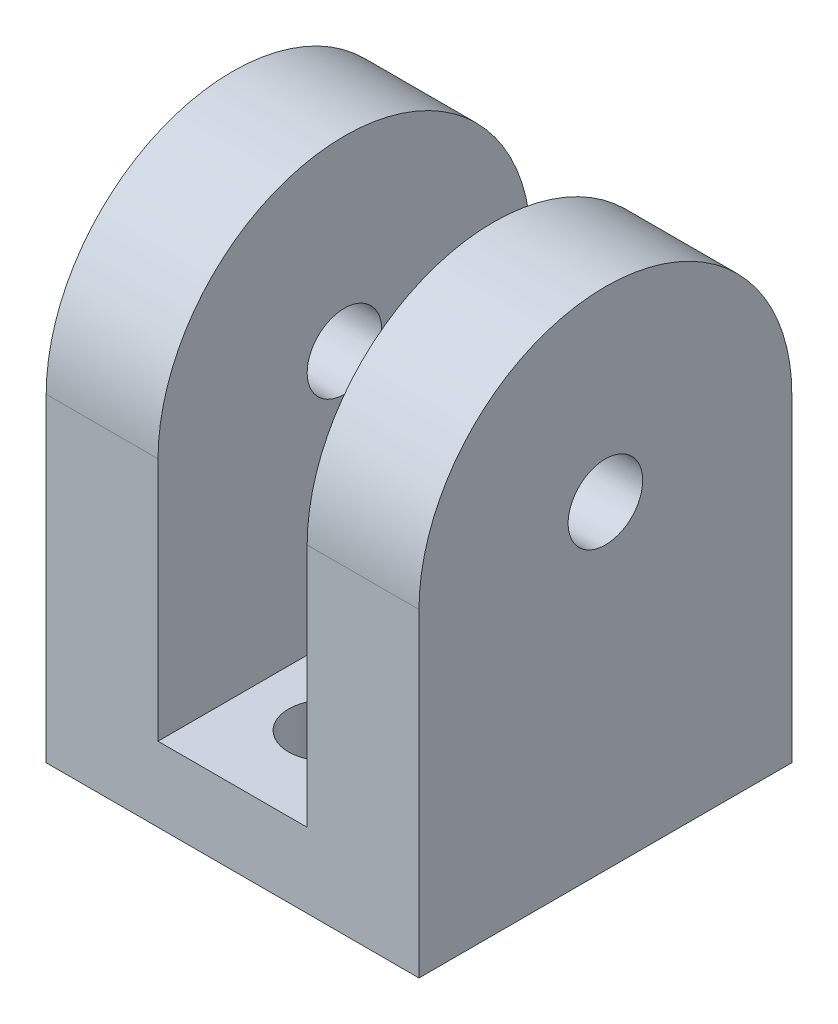
ISO-10303-21;
HEADER;
FILE_DESCRIPTION(('STEP AP214'),'2;1');
FILE_NAME('part.step','',(''),(''),'','','');
FILE_SCHEMA(('AUTOMOTIVE_DESIGN { 1 0 10303 214 1 1 1 1 }'));
ENDSEC;
DATA;
#1=APPLICATION_CONTEXT('core data for automotive mechanical design processes');
#2=APPLICATION_PROTOCOL_DEFINITION('international standard','automotive_design',2000,#1);
#3=PRODUCT_CONTEXT('',#1,'mechanical');
#4=PRODUCT('Part','Part','',(#3));
#5=PRODUCT_RELATED_PRODUCT_CATEGORY('part','',(#4));
#6=PRODUCT_DEFINITION_FORMATION('','',#4);
#7=PRODUCT_DEFINITION_CONTEXT('part definition',#1,'design');
#8=PRODUCT_DEFINITION('design','',#6,#7);
#9=PRODUCT_DEFINITION_SHAPE('','',#8);
#10=(LENGTH_UNIT() NAMED_UNIT(*) SI_UNIT(.MILLI.,.METRE.));
#11=(NAMED_UNIT(*) PLANE_ANGLE_UNIT() SI_UNIT($,.RADIAN.));
#12=(NAMED_UNIT(*) SI_UNIT($,.STERADIAN.) SOLID_ANGLE_UNIT());
#13=UNCERTAINTY_MEASURE_WITH_UNIT(LENGTH_MEASURE(1.E-05),#10,'distance_accuracy_value','');
#14=(GEOMETRIC_REPRESENTATION_CONTEXT(3) GLOBAL_UNCERTAINTY_ASSIGNED_CONTEXT((#13)) GLOBAL_UNIT_ASSIGNED_CONTEXT((#10,
#11,#12)) REPRESENTATION_CONTEXT('',''));
#15=CARTESIAN_POINT('',(0.,0.,0.));
#16=DIRECTION('',(0.,0.,1.));
#17=DIRECTION('',(1.,0.,0.));
#18=AXIS2_PLACEMENT_3D('',#15,#16,#17);
#19=CARTESIAN_POINT('',(0.,27.178,-15.875));
#20=DIRECTION('',(1.,0.,0.));
#21=DIRECTION('',(0.,0.,-1.));
#22=AXIS2_PLACEMENT_3D('',#19,#20,#21);
#23=CYLINDRICAL_SURFACE('',#22,15.875);
#24=DIRECTION('',(1.,0.,0.));
#25=VECTOR('',#24,1.);
#26=CARTESIAN_POINT('',(0.,27.178,0.));
#27=LINE('',#26,#25);
#28=CARTESIAN_POINT('',(0.,27.178,0.));
#29=VERTEX_POINT('',#28);
#30=CARTESIAN_POINT('',(9.525,27.178,0.));
#31=VERTEX_POINT('',#30);
#32=EDGE_CURVE('E141',#29,#31,#27,.T.);
#33=ORIENTED_EDGE('',*,*,#32,.T.);
#34=CARTESIAN_POINT('',(9.525,27.178,-15.875));
#35=DIRECTION('',(-1.,0.,0.));
#36=DIRECTION('',(0.,0.,1.));
#37=AXIS2_PLACEMENT_3D('',#34,#35,#36);
#38=CIRCLE('',#37,15.875);
#39=CARTESIAN_POINT('',(9.525,27.178,-31.75));
#40=VERTEX_POINT('',#39);
#41=EDGE_CURVE('E11',#31,#40,#38,.T.);
#42=ORIENTED_EDGE('',*,*,#41,.T.);
#43=DIRECTION('',(1.,0.,0.));
#44=VECTOR('',#43,1.);
#45=CARTESIAN_POINT('',(0.,27.178,-31.75));
#46=LINE('',#45,#44);
#47=CARTESIAN_POINT('',(0.,27.178,-31.75));
#48=VERTEX_POINT('',#47);
#49=EDGE_CURVE('E121',#48,#40,#46,.T.);
#50=ORIENTED_EDGE('',*,*,#49,.F.);
#51=CARTESIAN_POINT('',(0.,27.178,-15.875));
#52=DIRECTION('',(-1.,0.,0.));
#53=DIRECTION('',(0.,0.,1.));
#54=AXIS2_PLACEMENT_3D('',#51,#52,#53);
#55=CIRCLE('',#54,15.875);
#56=EDGE_CURVE('E134',#29,#48,#55,.T.);
#57=ORIENTED_EDGE('',*,*,#56,.F.);
#58=EDGE_LOOP('',(#33,#42,#50,#57));
#59=FACE_BOUND('',#58,.T.);
#60=ADVANCED_FACE('F34',(#59),#23,.T.);
#61=CARTESIAN_POINT('',(0.,50.8,-31.75));
#62=DIRECTION('',(0.,0.,1.));
#63=DIRECTION('',(1.,0.,0.));
#64=AXIS2_PLACEMENT_3D('',#61,#62,#63);
#65=PLANE('',#64);
#66=ORIENTED_EDGE('',*,*,#49,.T.);
#67=DIRECTION('',(0.,-1.,0.));
#68=VECTOR('',#67,1.);
#69=CARTESIAN_POINT('',(9.525,6.35,-31.75));
#70=LINE('',#69,#68);
#71=CARTESIAN_POINT('',(9.525,6.35,-31.75));
#72=VERTEX_POINT('',#71);
#73=EDGE_CURVE('E104',#40,#72,#70,.T.);
#74=ORIENTED_EDGE('',*,*,#73,.T.);
#75=DIRECTION('',(1.,0.,0.));
#76=VECTOR('',#75,1.);
#77=CARTESIAN_POINT('',(9.525,6.35,-31.75));
#78=LINE('',#77,#76);
#79=CARTESIAN_POINT('',(22.225,6.35,-31.75));
#80=VERTEX_POINT('',#79);
#81=EDGE_CURVE('E114',#72,#80,#78,.T.);
#82=ORIENTED_EDGE('',*,*,#81,.T.);
#83=DIRECTION('',(0.,1.,0.));
#84=VECTOR('',#83,1.);
#85=CARTESIAN_POINT('',(22.225,6.35,-31.75));
#86=LINE('',#85,#84);
#87=CARTESIAN_POINT('',(22.225,27.178,-31.75));
#88=VERTEX_POINT('',#87);
#89=EDGE_CURVE('E111',#80,#88,#86,.T.);
#90=ORIENTED_EDGE('',*,*,#89,.T.);
#91=CARTESIAN_POINT('',(31.75,27.178,-31.75));
#92=VERTEX_POINT('',#91);
#93=EDGE_CURVE('E58',#88,#92,#46,.T.);
#94=ORIENTED_EDGE('',*,*,#93,.T.);
#95=DIRECTION('',(0.,-1.,0.));
#96=VECTOR('',#95,1.);
#97=CARTESIAN_POINT('',(31.75,50.8,-31.75));
#98=LINE('',#97,#96);
#99=CARTESIAN_POINT('',(31.75,0.,-31.75));
#100=VERTEX_POINT('',#99);
#101=EDGE_CURVE('E157',#92,#100,#98,.T.);
#102=ORIENTED_EDGE('',*,*,#101,.T.);
#103=DIRECTION('',(-1.,0.,0.));
#104=VECTOR('',#103,1.);
#105=CARTESIAN_POINT('',(0.,0.,-31.75));
#106=LINE('',#105,#104);
#107=CARTESIAN_POINT('',(0.,0.,-31.75));
#108=VERTEX_POINT('',#107);
#109=EDGE_CURVE('E152',#100,#108,#106,.T.);
#110=ORIENTED_EDGE('',*,*,#109,.T.);
#111=DIRECTION('',(0.,-1.,0.));
#112=VECTOR('',#111,1.);
#113=CARTESIAN_POINT('',(0.,50.8,-31.75));
#114=LINE('',#113,#112);
#115=EDGE_CURVE('E155',#48,#108,#114,.T.);
#116=ORIENTED_EDGE('',*,*,#115,.F.);
#117=EDGE_LOOP('',(#66,#74,#82,#90,#94,#102,#110,#116));
#118=FACE_BOUND('',#117,.T.);
#119=ADVANCED_FACE('F119',(#118),#65,.F.);
#120=CARTESIAN_POINT('',(0.,50.8,0.));
#121=DIRECTION('',(1.,0.,0.));
#122=DIRECTION('',(0.,0.,-1.));
#123=AXIS2_PLACEMENT_3D('',#120,#121,#122);
#124=PLANE('',#123);
#125=CARTESIAN_POINT('',(0.,27.178,-15.875));
#126=DIRECTION('',(1.,0.,0.));
#127=DIRECTION('',(0.,0.,-1.));
#128=AXIS2_PLACEMENT_3D('',#125,#126,#127);
#129=CIRCLE('',#128,3.17499999999999);
#130=CARTESIAN_POINT('',(0.,27.178,-19.05));
#131=VERTEX_POINT('',#130);
#132=EDGE_CURVE('E215',#131,#131,#129,.T.);
#133=ORIENTED_EDGE('',*,*,#132,.T.);
#134=EDGE_LOOP('',(#133));
#135=FACE_BOUND('',#134,.T.);
#136=DIRECTION('',(0.,-1.,0.));
#137=VECTOR('',#136,1.);
#138=CARTESIAN_POINT('',(0.,50.8,0.));
#139=LINE('',#138,#137);
#140=CARTESIAN_POINT('',(0.,0.,0.));
#141=VERTEX_POINT('',#140);
#142=EDGE_CURVE('E161',#29,#141,#139,.T.);
#143=ORIENTED_EDGE('',*,*,#142,.F.);
#144=ORIENTED_EDGE('',*,*,#56,.T.);
#145=ORIENTED_EDGE('',*,*,#115,.T.);
#146=DIRECTION('',(0.,0.,1.));
#147=VECTOR('',#146,1.);
#148=CARTESIAN_POINT('',(0.,0.,0.));
#149=LINE('',#148,#147);
#150=EDGE_CURVE('E140',#108,#141,#149,.T.);
#151=ORIENTED_EDGE('',*,*,#150,.T.);
#152=EDGE_LOOP('',(#143,#144,#145,#151));
#153=FACE_BOUND('',#152,.T.);
#154=ADVANCED_FACE('F36',(#135,#153),#124,.F.);
#155=CARTESIAN_POINT('',(0.,50.8,0.));
#156=DIRECTION('',(0.,0.,-1.));
#157=DIRECTION('',(-1.,0.,0.));
#158=AXIS2_PLACEMENT_3D('',#155,#156,#157);
#159=PLANE('',#158);
#160=DIRECTION('',(1.,0.,0.));
#161=VECTOR('',#160,1.);
#162=CARTESIAN_POINT('',(9.525,6.35,0.));
#163=LINE('',#162,#161);
#164=CARTESIAN_POINT('',(9.525,6.35,0.));
#165=VERTEX_POINT('',#164);
#166=CARTESIAN_POINT('',(22.225,6.35,0.));
#167=VERTEX_POINT('',#166);
#168=EDGE_CURVE('E123',#165,#167,#163,.T.);
#169=ORIENTED_EDGE('',*,*,#168,.F.);
#170=DIRECTION('',(0.,-1.,0.));
#171=VECTOR('',#170,1.);
#172=CARTESIAN_POINT('',(9.525,6.35,0.));
#173=LINE('',#172,#171);
#174=EDGE_CURVE('E106',#31,#165,#173,.T.);
#175=ORIENTED_EDGE('',*,*,#174,.F.);
#176=ORIENTED_EDGE('',*,*,#32,.F.);
#177=ORIENTED_EDGE('',*,*,#142,.T.);
#178=DIRECTION('',(1.,0.,0.));
#179=VECTOR('',#178,1.);
#180=CARTESIAN_POINT('',(0.,0.,0.));
#181=LINE('',#180,#179);
#182=CARTESIAN_POINT('',(31.75,0.,0.));
#183=VERTEX_POINT('',#182);
#184=EDGE_CURVE('E146',#141,#183,#181,.T.);
#185=ORIENTED_EDGE('',*,*,#184,.T.);
#186=DIRECTION('',(0.,-1.,0.));
#187=VECTOR('',#186,1.);
#188=CARTESIAN_POINT('',(31.75,50.8,0.));
#189=LINE('',#188,#187);
#190=CARTESIAN_POINT('',(31.75,27.178,0.));
#191=VERTEX_POINT('',#190);
#192=EDGE_CURVE('E159',#191,#183,#189,.T.);
#193=ORIENTED_EDGE('',*,*,#192,.F.);
#194=CARTESIAN_POINT('',(22.225,27.178,0.));
#195=VERTEX_POINT('',#194);
#196=EDGE_CURVE('E137',#195,#191,#27,.T.);
#197=ORIENTED_EDGE('',*,*,#196,.F.);
#198=DIRECTION('',(0.,1.,0.));
#199=VECTOR('',#198,1.);
#200=CARTESIAN_POINT('',(22.225,6.35,0.));
#201=LINE('',#200,#199);
#202=EDGE_CURVE('E50',#167,#195,#201,.T.);
#203=ORIENTED_EDGE('',*,*,#202,.F.);
#204=EDGE_LOOP('',(#169,#175,#176,#177,#185,#193,#197,#203));
#205=FACE_BOUND('',#204,.T.);
#206=ADVANCED_FACE('F169',(#205),#159,.F.);
#207=CARTESIAN_POINT('',(31.75,50.8,0.));
#208=DIRECTION('',(-1.,0.,0.));
#209=DIRECTION('',(0.,0.,1.));
#210=AXIS2_PLACEMENT_3D('',#207,#208,#209);
#211=PLANE('',#210);
#212=CARTESIAN_POINT('',(31.75,27.178,-15.875));
#213=DIRECTION('',(1.,0.,0.));
#214=DIRECTION('',(0.,0.,-1.));
#215=AXIS2_PLACEMENT_3D('',#212,#213,#214);
#216=CIRCLE('',#215,3.17499999999999);
#217=CARTESIAN_POINT('',(31.75,27.178,-19.05));
#218=VERTEX_POINT('',#217);
#219=EDGE_CURVE('E217',#218,#218,#216,.T.);
#220=ORIENTED_EDGE('',*,*,#219,.F.);
#221=EDGE_LOOP('',(#220));
#222=FACE_BOUND('',#221,.T.);
#223=ORIENTED_EDGE('',*,*,#101,.F.);
#224=CARTESIAN_POINT('',(31.75,27.178,-15.875));
#225=DIRECTION('',(-1.,0.,0.));
#226=DIRECTION('',(0.,0.,1.));
#227=AXIS2_PLACEMENT_3D('',#224,#225,#226);
#228=CIRCLE('',#227,15.875);
#229=EDGE_CURVE('E132',#191,#92,#228,.T.);
#230=ORIENTED_EDGE('',*,*,#229,.F.);
#231=ORIENTED_EDGE('',*,*,#192,.T.);
#232=DIRECTION('',(0.,0.,-1.));
#233=VECTOR('',#232,1.);
#234=CARTESIAN_POINT('',(31.75,0.,0.));
#235=LINE('',#234,#233);
#236=EDGE_CURVE('E149',#183,#100,#235,.T.);
#237=ORIENTED_EDGE('',*,*,#236,.T.);
#238=EDGE_LOOP('',(#223,#230,#231,#237));
#239=FACE_BOUND('',#238,.T.);
#240=ADVANCED_FACE('F174',(#222,#239),#211,.F.);
#241=CARTESIAN_POINT('',(0.,0.,0.));
#242=DIRECTION('',(0.,-1.,0.));
#243=DIRECTION('',(0.,0.,-1.));
#244=AXIS2_PLACEMENT_3D('',#241,#242,#243);
#245=PLANE('',#244);
#246=CARTESIAN_POINT('',(15.875,0.,-23.8125));
#247=DIRECTION('',(0.,1.,0.));
#248=DIRECTION('',(0.,0.,1.));
#249=AXIS2_PLACEMENT_3D('',#246,#247,#248);
#250=CIRCLE('',#249,3.17499999999999);
#251=CARTESIAN_POINT('',(15.875,0.,-20.6375));
#252=VERTEX_POINT('',#251);
#253=EDGE_CURVE('E229',#252,#252,#250,.T.);
#254=ORIENTED_EDGE('',*,*,#253,.T.);
#255=EDGE_LOOP('',(#254));
#256=FACE_BOUND('',#255,.T.);
#257=CARTESIAN_POINT('',(15.875,0.,-7.9375));
#258=DIRECTION('',(0.,1.,0.));
#259=DIRECTION('',(0.,0.,1.));
#260=AXIS2_PLACEMENT_3D('',#257,#258,#259);
#261=CIRCLE('',#260,3.17499999999999);
#262=CARTESIAN_POINT('',(15.875,0.,-4.76250000000001));
#263=VERTEX_POINT('',#262);
#264=EDGE_CURVE('E126',#263,#263,#261,.T.);
#265=ORIENTED_EDGE('',*,*,#264,.T.);
#266=EDGE_LOOP('',(#265));
#267=FACE_BOUND('',#266,.T.);
#268=ORIENTED_EDGE('',*,*,#150,.F.);
#269=ORIENTED_EDGE('',*,*,#109,.F.);
#270=ORIENTED_EDGE('',*,*,#236,.F.);
#271=ORIENTED_EDGE('',*,*,#184,.F.);
#272=EDGE_LOOP('',(#268,#269,#270,#271));
#273=FACE_BOUND('',#272,.T.);
#274=ADVANCED_FACE('F178',(#256,#267,#273),#245,.T.);
#275=ORIENTED_EDGE('',*,*,#93,.F.);
#276=CARTESIAN_POINT('',(22.225,27.178,-15.875));
#277=DIRECTION('',(1.,0.,0.));
#278=DIRECTION('',(0.,1.,0.));
#279=AXIS2_PLACEMENT_3D('',#276,#277,#278);
#280=CIRCLE('',#279,15.875);
#281=EDGE_CURVE('E43',#88,#195,#280,.T.);
#282=ORIENTED_EDGE('',*,*,#281,.T.);
#283=ORIENTED_EDGE('',*,*,#196,.T.);
#284=ORIENTED_EDGE('',*,*,#229,.T.);
#285=EDGE_LOOP('',(#275,#282,#283,#284));
#286=FACE_BOUND('',#285,.T.);
#287=ADVANCED_FACE('F165',(#286),#23,.T.);
#288=CARTESIAN_POINT('',(9.525,6.35,-31.75));
#289=DIRECTION('',(-1.,0.,0.));
#290=DIRECTION('',(0.,0.,1.));
#291=AXIS2_PLACEMENT_3D('',#288,#289,#290);
#292=PLANE('',#291);
#293=CARTESIAN_POINT('',(9.52500000000001,27.178,-15.875));
#294=DIRECTION('',(-1.,0.,0.));
#295=DIRECTION('',(0.,0.,1.));
#296=AXIS2_PLACEMENT_3D('',#293,#294,#295);
#297=CIRCLE('',#296,3.17499999999999);
#298=CARTESIAN_POINT('',(9.52500000000001,27.178,-12.7));
#299=VERTEX_POINT('',#298);
#300=EDGE_CURVE('E220',#299,#299,#297,.T.);
#301=ORIENTED_EDGE('',*,*,#300,.T.);
#302=EDGE_LOOP('',(#301));
#303=FACE_BOUND('',#302,.T.);
#304=ORIENTED_EDGE('',*,*,#174,.T.);
#305=DIRECTION('',(0.,0.,1.));
#306=VECTOR('',#305,1.);
#307=CARTESIAN_POINT('',(9.525,6.35,-31.75));
#308=LINE('',#307,#306);
#309=EDGE_CURVE('E100',#72,#165,#308,.T.);
#310=ORIENTED_EDGE('',*,*,#309,.F.);
#311=ORIENTED_EDGE('',*,*,#73,.F.);
#312=ORIENTED_EDGE('',*,*,#41,.F.);
#313=EDGE_LOOP('',(#304,#310,#311,#312));
#314=FACE_BOUND('',#313,.T.);
#315=ADVANCED_FACE('F102',(#303,#314),#292,.F.);
#316=CARTESIAN_POINT('',(22.225,6.35,-31.75));
#317=DIRECTION('',(1.,0.,0.));
#318=DIRECTION('',(0.,1.,0.));
#319=AXIS2_PLACEMENT_3D('',#316,#317,#318);
#320=PLANE('',#319);
#321=CARTESIAN_POINT('',(22.225,27.178,-15.875));
#322=DIRECTION('',(1.,0.,0.));
#323=DIRECTION('',(0.,1.,0.));
#324=AXIS2_PLACEMENT_3D('',#321,#322,#323);
#325=CIRCLE('',#324,3.17499999999999);
#326=CARTESIAN_POINT('',(22.225,30.353,-15.875));
#327=VERTEX_POINT('',#326);
#328=EDGE_CURVE('E38',#327,#327,#325,.T.);
#329=ORIENTED_EDGE('',*,*,#328,.T.);
#330=EDGE_LOOP('',(#329));
#331=FACE_BOUND('',#330,.T.);
#332=ORIENTED_EDGE('',*,*,#89,.F.);
#333=DIRECTION('',(0.,0.,1.));
#334=VECTOR('',#333,1.);
#335=CARTESIAN_POINT('',(22.225,6.35,-31.75));
#336=LINE('',#335,#334);
#337=EDGE_CURVE('E110',#80,#167,#336,.T.);
#338=ORIENTED_EDGE('',*,*,#337,.T.);
#339=ORIENTED_EDGE('',*,*,#202,.T.);
#340=ORIENTED_EDGE('',*,*,#281,.F.);
#341=EDGE_LOOP('',(#332,#338,#339,#340));
#342=FACE_BOUND('',#341,.T.);
#343=ADVANCED_FACE('F196',(#331,#342),#320,.F.);
#344=CARTESIAN_POINT('',(9.525,6.35,-31.75));
#345=DIRECTION('',(0.,-1.,0.));
#346=DIRECTION('',(1.,0.,0.));
#347=AXIS2_PLACEMENT_3D('',#344,#345,#346);
#348=PLANE('',#347);
#349=CARTESIAN_POINT('',(15.875,6.35,-23.8125));
#350=DIRECTION('',(0.,1.,0.));
#351=DIRECTION('',(0.,0.,1.));
#352=AXIS2_PLACEMENT_3D('',#349,#350,#351);
#353=CIRCLE('',#352,3.17499999999999);
#354=CARTESIAN_POINT('',(15.875,6.35,-20.6375));
#355=VERTEX_POINT('',#354);
#356=EDGE_CURVE('E226',#355,#355,#353,.T.);
#357=ORIENTED_EDGE('',*,*,#356,.F.);
#358=EDGE_LOOP('',(#357));
#359=FACE_BOUND('',#358,.T.);
#360=CARTESIAN_POINT('',(15.875,6.35,-7.9375));
#361=DIRECTION('',(0.,1.,0.));
#362=DIRECTION('',(0.,0.,1.));
#363=AXIS2_PLACEMENT_3D('',#360,#361,#362);
#364=CIRCLE('',#363,3.17499999999999);
#365=CARTESIAN_POINT('',(15.875,6.35,-4.76250000000001));
#366=VERTEX_POINT('',#365);
#367=EDGE_CURVE('E230',#366,#366,#364,.T.);
#368=ORIENTED_EDGE('',*,*,#367,.F.);
#369=EDGE_LOOP('',(#368));
#370=FACE_BOUND('',#369,.T.);
#371=ORIENTED_EDGE('',*,*,#168,.T.);
#372=ORIENTED_EDGE('',*,*,#337,.F.);
#373=ORIENTED_EDGE('',*,*,#81,.F.);
#374=ORIENTED_EDGE('',*,*,#309,.T.);
#375=EDGE_LOOP('',(#371,#372,#373,#374));
#376=FACE_BOUND('',#375,.T.);
#377=ADVANCED_FACE('F115',(#359,#370,#376),#348,.F.);
#378=CARTESIAN_POINT('',(15.875,6.35,-7.9375));
#379=DIRECTION('',(0.,1.,0.));
#380=DIRECTION('',(0.,0.,1.));
#381=AXIS2_PLACEMENT_3D('',#378,#379,#380);
#382=CYLINDRICAL_SURFACE('',#381,3.17499999999999);
#383=ORIENTED_EDGE('',*,*,#264,.F.);
#384=EDGE_LOOP('',(#383));
#385=FACE_BOUND('',#384,.T.);
#386=ORIENTED_EDGE('',*,*,#367,.T.);
#387=EDGE_LOOP('',(#386));
#388=FACE_BOUND('',#387,.T.);
#389=ADVANCED_FACE('F237',(#385,#388),#382,.F.);
#390=CARTESIAN_POINT('',(15.875,6.35,-23.8125));
#391=DIRECTION('',(0.,1.,0.));
#392=DIRECTION('',(0.,0.,1.));
#393=AXIS2_PLACEMENT_3D('',#390,#391,#392);
#394=CYLINDRICAL_SURFACE('',#393,3.17499999999999);
#395=ORIENTED_EDGE('',*,*,#253,.F.);
#396=EDGE_LOOP('',(#395));
#397=FACE_BOUND('',#396,.T.);
#398=ORIENTED_EDGE('',*,*,#356,.T.);
#399=EDGE_LOOP('',(#398));
#400=FACE_BOUND('',#399,.T.);
#401=ADVANCED_FACE('F239',(#397,#400),#394,.F.);
#402=CARTESIAN_POINT('',(31.75,27.178,-15.875));
#403=DIRECTION('',(1.,0.,0.));
#404=DIRECTION('',(0.,0.,-1.));
#405=AXIS2_PLACEMENT_3D('',#402,#403,#404);
#406=CYLINDRICAL_SURFACE('',#405,3.17499999999999);
#407=ORIENTED_EDGE('',*,*,#219,.T.);
#408=EDGE_LOOP('',(#407));
#409=FACE_BOUND('',#408,.T.);
#410=ORIENTED_EDGE('',*,*,#328,.F.);
#411=EDGE_LOOP('',(#410));
#412=FACE_BOUND('',#411,.T.);
#413=ADVANCED_FACE('F245',(#409,#412),#406,.F.);
#414=ORIENTED_EDGE('',*,*,#132,.F.);
#415=EDGE_LOOP('',(#414));
#416=FACE_BOUND('',#415,.T.);
#417=ORIENTED_EDGE('',*,*,#300,.F.);
#418=EDGE_LOOP('',(#417));
#419=FACE_BOUND('',#418,.T.);
#420=ADVANCED_FACE('F259',(#416,#419),#406,.F.);
#421=CLOSED_SHELL('',(#60,#119,#154,#206,#240,#274,#287,#315,#343,#377,#389,#401,#413,#420));
#422=MANIFOLD_SOLID_BREP('B2',#421);
#423=ADVANCED_BREP_SHAPE_REPRESENTATION('',(#18,#422),#14);
#424=SHAPE_DEFINITION_REPRESENTATION(#9,#423);
ENDSEC;
END-ISO-10303-21;
